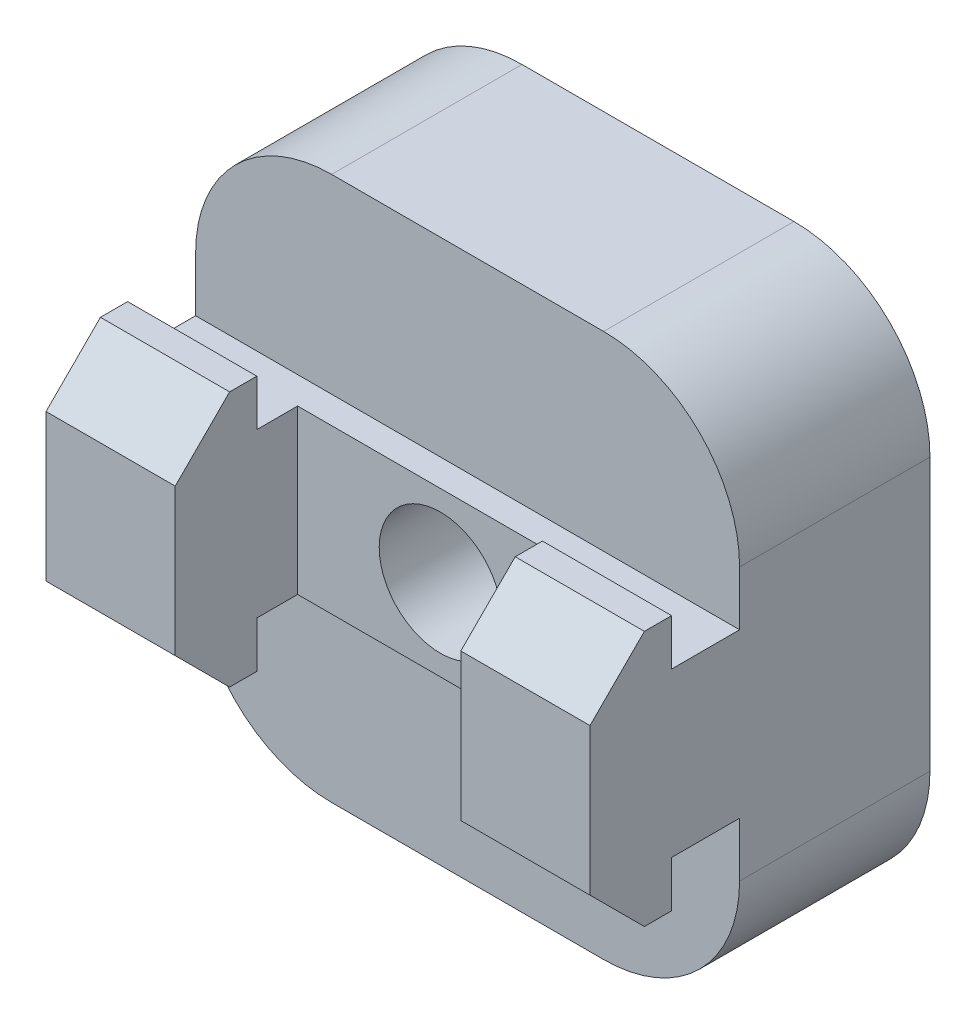
ISO-10303-21;
HEADER;
FILE_DESCRIPTION(('STEP AP214'),'2;1');
FILE_NAME('part.step','',(''),(''),'','','');
FILE_SCHEMA(('AUTOMOTIVE_DESIGN { 1 0 10303 214 1 1 1 1 }'));
ENDSEC;
DATA;
#1=APPLICATION_CONTEXT('core data for automotive mechanical design processes');
#2=APPLICATION_PROTOCOL_DEFINITION('international standard','automotive_design',2000,#1);
#3=PRODUCT_CONTEXT('',#1,'mechanical');
#4=PRODUCT('Part','Part','',(#3));
#5=PRODUCT_RELATED_PRODUCT_CATEGORY('part','',(#4));
#6=PRODUCT_DEFINITION_FORMATION('','',#4);
#7=PRODUCT_DEFINITION_CONTEXT('part definition',#1,'design');
#8=PRODUCT_DEFINITION('design','',#6,#7);
#9=PRODUCT_DEFINITION_SHAPE('','',#8);
#10=(LENGTH_UNIT() NAMED_UNIT(*) SI_UNIT(.MILLI.,.METRE.));
#11=(NAMED_UNIT(*) PLANE_ANGLE_UNIT() SI_UNIT($,.RADIAN.));
#12=(NAMED_UNIT(*) SI_UNIT($,.STERADIAN.) SOLID_ANGLE_UNIT());
#13=UNCERTAINTY_MEASURE_WITH_UNIT(LENGTH_MEASURE(1.E-05),#10,'distance_accuracy_value','');
#14=(GEOMETRIC_REPRESENTATION_CONTEXT(3) GLOBAL_UNCERTAINTY_ASSIGNED_CONTEXT((#13)) GLOBAL_UNIT_ASSIGNED_CONTEXT((#10,
#11,#12)) REPRESENTATION_CONTEXT('',''));
#15=CARTESIAN_POINT('',(0.,0.,0.));
#16=DIRECTION('',(0.,0.,1.));
#17=DIRECTION('',(1.,0.,0.));
#18=AXIS2_PLACEMENT_3D('',#15,#16,#17);
#19=CARTESIAN_POINT('',(10.,3.,9.5));
#20=DIRECTION('',(0.,0.,1.));
#21=DIRECTION('',(0.,-1.,0.));
#22=AXIS2_PLACEMENT_3D('',#19,#20,#21);
#23=PLANE('',#22);
#24=DIRECTION('',(0.,-1.,0.));
#25=VECTOR('',#24,1.);
#26=CARTESIAN_POINT('',(5.25,3.,9.5));
#27=LINE('',#26,#25);
#28=CARTESIAN_POINT('',(5.25,4.7,9.5));
#29=VERTEX_POINT('',#28);
#30=CARTESIAN_POINT('',(5.25,3.,9.5));
#31=VERTEX_POINT('',#30);
#32=EDGE_CURVE('E268',#29,#31,#27,.T.);
#33=ORIENTED_EDGE('',*,*,#32,.F.);
#34=DIRECTION('',(-1.,0.,0.));
#35=VECTOR('',#34,1.);
#36=CARTESIAN_POINT('',(10.,4.7,9.5));
#37=LINE('',#36,#35);
#38=CARTESIAN_POINT('',(10.,4.7,9.5));
#39=VERTEX_POINT('',#38);
#40=EDGE_CURVE('E415',#39,#29,#37,.T.);
#41=ORIENTED_EDGE('',*,*,#40,.F.);
#42=DIRECTION('',(0.,1.,0.));
#43=VECTOR('',#42,1.);
#44=CARTESIAN_POINT('',(10.,3.,9.5));
#45=LINE('',#44,#43);
#46=CARTESIAN_POINT('',(10.,3.,9.5));
#47=VERTEX_POINT('',#46);
#48=EDGE_CURVE('E321',#47,#39,#45,.T.);
#49=ORIENTED_EDGE('',*,*,#48,.F.);
#50=DIRECTION('',(-1.,0.,0.));
#51=VECTOR('',#50,1.);
#52=CARTESIAN_POINT('',(10.,3.,9.5));
#53=LINE('',#52,#51);
#54=EDGE_CURVE('E420',#47,#31,#53,.T.);
#55=ORIENTED_EDGE('',*,*,#54,.T.);
#56=EDGE_LOOP('',(#33,#41,#49,#55));
#57=FACE_BOUND('',#56,.T.);
#58=ADVANCED_FACE('F45',(#57),#23,.F.);
#59=CARTESIAN_POINT('',(10.,4.7,9.5));
#60=DIRECTION('',(0.,-1.,0.));
#61=DIRECTION('',(0.,0.,-1.));
#62=AXIS2_PLACEMENT_3D('',#59,#60,#61);
#63=PLANE('',#62);
#64=DIRECTION('',(0.,0.,-1.));
#65=VECTOR('',#64,1.);
#66=CARTESIAN_POINT('',(5.25,4.7,9.5));
#67=LINE('',#66,#65);
#68=CARTESIAN_POINT('',(5.25,4.7,10.5));
#69=VERTEX_POINT('',#68);
#70=EDGE_CURVE('E529',#69,#29,#67,.T.);
#71=ORIENTED_EDGE('',*,*,#70,.F.);
#72=DIRECTION('',(-1.,0.,0.));
#73=VECTOR('',#72,1.);
#74=CARTESIAN_POINT('',(10.,4.7,10.5));
#75=LINE('',#74,#73);
#76=CARTESIAN_POINT('',(10.,4.7,10.5));
#77=VERTEX_POINT('',#76);
#78=EDGE_CURVE('E410',#77,#69,#75,.T.);
#79=ORIENTED_EDGE('',*,*,#78,.F.);
#80=DIRECTION('',(0.,0.,1.));
#81=VECTOR('',#80,1.);
#82=CARTESIAN_POINT('',(10.,4.7,9.5));
#83=LINE('',#82,#81);
#84=EDGE_CURVE('E324',#39,#77,#83,.T.);
#85=ORIENTED_EDGE('',*,*,#84,.F.);
#86=ORIENTED_EDGE('',*,*,#40,.T.);
#87=EDGE_LOOP('',(#71,#79,#85,#86));
#88=FACE_BOUND('',#87,.T.);
#89=ADVANCED_FACE('F527',(#88),#63,.F.);
#90=CARTESIAN_POINT('',(10.,4.7,10.5));
#91=DIRECTION('',(0.,-0.707106781186547,-0.707106781186548));
#92=DIRECTION('',(0.,0.707106781186548,-0.707106781186547));
#93=AXIS2_PLACEMENT_3D('',#90,#91,#92);
#94=PLANE('',#93);
#95=DIRECTION('',(0.,0.707106781186548,-0.707106781186547));
#96=VECTOR('',#95,1.);
#97=CARTESIAN_POINT('',(5.25,4.7,10.5));
#98=LINE('',#97,#96);
#99=CARTESIAN_POINT('',(5.25,2.7,12.5));
#100=VERTEX_POINT('',#99);
#101=EDGE_CURVE('E646',#100,#69,#98,.T.);
#102=ORIENTED_EDGE('',*,*,#101,.F.);
#103=DIRECTION('',(-1.,0.,0.));
#104=VECTOR('',#103,1.);
#105=CARTESIAN_POINT('',(10.,2.7,12.5));
#106=LINE('',#105,#104);
#107=CARTESIAN_POINT('',(10.,2.7,12.5));
#108=VERTEX_POINT('',#107);
#109=EDGE_CURVE('E405',#108,#100,#106,.T.);
#110=ORIENTED_EDGE('',*,*,#109,.F.);
#111=DIRECTION('',(0.,-0.707106781186548,0.707106781186547));
#112=VECTOR('',#111,1.);
#113=CARTESIAN_POINT('',(10.,4.7,10.5));
#114=LINE('',#113,#112);
#115=EDGE_CURVE('E327',#77,#108,#114,.T.);
#116=ORIENTED_EDGE('',*,*,#115,.F.);
#117=ORIENTED_EDGE('',*,*,#78,.T.);
#118=EDGE_LOOP('',(#102,#110,#116,#117));
#119=FACE_BOUND('',#118,.T.);
#120=ADVANCED_FACE('F533',(#119),#94,.F.);
#121=CARTESIAN_POINT('',(10.,2.7,12.5));
#122=DIRECTION('',(0.,0.,-1.));
#123=DIRECTION('',(-1.,0.,0.));
#124=AXIS2_PLACEMENT_3D('',#121,#122,#123);
#125=PLANE('',#124);
#126=DIRECTION('',(0.,1.,0.));
#127=VECTOR('',#126,1.);
#128=CARTESIAN_POINT('',(5.25,2.7,12.5));
#129=LINE('',#128,#127);
#130=CARTESIAN_POINT('',(5.25,-2.7,12.5));
#131=VERTEX_POINT('',#130);
#132=EDGE_CURVE('E541',#131,#100,#129,.T.);
#133=ORIENTED_EDGE('',*,*,#132,.F.);
#134=DIRECTION('',(-1.,0.,0.));
#135=VECTOR('',#134,1.);
#136=CARTESIAN_POINT('',(10.,-2.7,12.5));
#137=LINE('',#136,#135);
#138=CARTESIAN_POINT('',(10.,-2.7,12.5));
#139=VERTEX_POINT('',#138);
#140=EDGE_CURVE('E400',#139,#131,#137,.T.);
#141=ORIENTED_EDGE('',*,*,#140,.F.);
#142=DIRECTION('',(0.,-1.,0.));
#143=VECTOR('',#142,1.);
#144=CARTESIAN_POINT('',(10.,2.7,12.5));
#145=LINE('',#144,#143);
#146=EDGE_CURVE('E330',#108,#139,#145,.T.);
#147=ORIENTED_EDGE('',*,*,#146,.F.);
#148=ORIENTED_EDGE('',*,*,#109,.T.);
#149=EDGE_LOOP('',(#133,#141,#147,#148));
#150=FACE_BOUND('',#149,.T.);
#151=ADVANCED_FACE('F540',(#150),#125,.F.);
#152=CARTESIAN_POINT('',(10.,-4.7,10.5));
#153=DIRECTION('',(0.,0.707106781186547,-0.707106781186548));
#154=DIRECTION('',(0.,0.707106781186548,0.707106781186547));
#155=AXIS2_PLACEMENT_3D('',#152,#153,#154);
#156=PLANE('',#155);
#157=DIRECTION('',(0.,0.707106781186548,0.707106781186547));
#158=VECTOR('',#157,1.);
#159=CARTESIAN_POINT('',(5.25,-4.7,10.5));
#160=LINE('',#159,#158);
#161=CARTESIAN_POINT('',(5.25,-4.7,10.5));
#162=VERTEX_POINT('',#161);
#163=EDGE_CURVE('E546',#162,#131,#160,.T.);
#164=ORIENTED_EDGE('',*,*,#163,.F.);
#165=DIRECTION('',(-1.,0.,0.));
#166=VECTOR('',#165,1.);
#167=CARTESIAN_POINT('',(10.,-4.7,10.5));
#168=LINE('',#167,#166);
#169=CARTESIAN_POINT('',(10.,-4.7,10.5));
#170=VERTEX_POINT('',#169);
#171=EDGE_CURVE('E395',#170,#162,#168,.T.);
#172=ORIENTED_EDGE('',*,*,#171,.F.);
#173=DIRECTION('',(0.,-0.707106781186548,-0.707106781186547));
#174=VECTOR('',#173,1.);
#175=CARTESIAN_POINT('',(10.,-4.7,10.5));
#176=LINE('',#175,#174);
#177=EDGE_CURVE('E333',#139,#170,#176,.T.);
#178=ORIENTED_EDGE('',*,*,#177,.F.);
#179=ORIENTED_EDGE('',*,*,#140,.T.);
#180=EDGE_LOOP('',(#164,#172,#178,#179));
#181=FACE_BOUND('',#180,.T.);
#182=ADVANCED_FACE('F544',(#181),#156,.F.);
#183=CARTESIAN_POINT('',(10.,-4.7,9.5));
#184=DIRECTION('',(0.,1.,0.));
#185=DIRECTION('',(0.,0.,1.));
#186=AXIS2_PLACEMENT_3D('',#183,#184,#185);
#187=PLANE('',#186);
#188=DIRECTION('',(0.,0.,1.));
#189=VECTOR('',#188,1.);
#190=CARTESIAN_POINT('',(5.25,-4.7,9.5));
#191=LINE('',#190,#189);
#192=CARTESIAN_POINT('',(5.25,-4.7,9.5));
#193=VERTEX_POINT('',#192);
#194=EDGE_CURVE('E244',#193,#162,#191,.T.);
#195=ORIENTED_EDGE('',*,*,#194,.F.);
#196=DIRECTION('',(-1.,0.,0.));
#197=VECTOR('',#196,1.);
#198=CARTESIAN_POINT('',(10.,-4.7,9.5));
#199=LINE('',#198,#197);
#200=CARTESIAN_POINT('',(10.,-4.7,9.5));
#201=VERTEX_POINT('',#200);
#202=EDGE_CURVE('E390',#201,#193,#199,.T.);
#203=ORIENTED_EDGE('',*,*,#202,.F.);
#204=DIRECTION('',(0.,0.,-1.));
#205=VECTOR('',#204,1.);
#206=CARTESIAN_POINT('',(10.,-4.7,9.5));
#207=LINE('',#206,#205);
#208=EDGE_CURVE('E336',#170,#201,#207,.T.);
#209=ORIENTED_EDGE('',*,*,#208,.F.);
#210=ORIENTED_EDGE('',*,*,#171,.T.);
#211=EDGE_LOOP('',(#195,#203,#209,#210));
#212=FACE_BOUND('',#211,.T.);
#213=ADVANCED_FACE('F550',(#212),#187,.F.);
#214=CARTESIAN_POINT('',(10.,-3.,9.5));
#215=DIRECTION('',(0.,0.,1.));
#216=DIRECTION('',(0.,-1.,0.));
#217=AXIS2_PLACEMENT_3D('',#214,#215,#216);
#218=PLANE('',#217);
#219=DIRECTION('',(0.,-1.,0.));
#220=VECTOR('',#219,1.);
#221=CARTESIAN_POINT('',(5.25,-3.,9.5));
#222=LINE('',#221,#220);
#223=CARTESIAN_POINT('',(5.25,-3.,9.5));
#224=VERTEX_POINT('',#223);
#225=EDGE_CURVE('E447',#224,#193,#222,.T.);
#226=ORIENTED_EDGE('',*,*,#225,.F.);
#227=DIRECTION('',(-1.,0.,0.));
#228=VECTOR('',#227,1.);
#229=CARTESIAN_POINT('',(10.,-3.,9.5));
#230=LINE('',#229,#228);
#231=CARTESIAN_POINT('',(10.,-3.,9.5));
#232=VERTEX_POINT('',#231);
#233=EDGE_CURVE('E259',#232,#224,#230,.T.);
#234=ORIENTED_EDGE('',*,*,#233,.F.);
#235=DIRECTION('',(0.,1.,0.));
#236=VECTOR('',#235,1.);
#237=CARTESIAN_POINT('',(10.,-3.,9.5));
#238=LINE('',#237,#236);
#239=EDGE_CURVE('E339',#201,#232,#238,.T.);
#240=ORIENTED_EDGE('',*,*,#239,.F.);
#241=ORIENTED_EDGE('',*,*,#202,.T.);
#242=EDGE_LOOP('',(#226,#234,#240,#241));
#243=FACE_BOUND('',#242,.T.);
#244=ADVANCED_FACE('F554',(#243),#218,.F.);
#245=CARTESIAN_POINT('',(10.,-3.,9.5));
#246=DIRECTION('',(0.,1.,0.));
#247=DIRECTION('',(0.,0.,1.));
#248=AXIS2_PLACEMENT_3D('',#245,#246,#247);
#249=PLANE('',#248);
#250=DIRECTION('',(-1.,0.,0.));
#251=VECTOR('',#250,1.);
#252=CARTESIAN_POINT('',(10.,-3.,8.));
#253=LINE('',#252,#251);
#254=CARTESIAN_POINT('',(5.25,-3.,8.));
#255=VERTEX_POINT('',#254);
#256=CARTESIAN_POINT('',(-5.25,-3.,8.));
#257=VERTEX_POINT('',#256);
#258=EDGE_CURVE('E233',#255,#257,#253,.T.);
#259=ORIENTED_EDGE('',*,*,#258,.T.);
#260=DIRECTION('',(0.,0.,1.));
#261=VECTOR('',#260,1.);
#262=CARTESIAN_POINT('',(-5.25,-3.,9.5));
#263=LINE('',#262,#261);
#264=CARTESIAN_POINT('',(-5.25,-3.,9.5));
#265=VERTEX_POINT('',#264);
#266=EDGE_CURVE('E295',#257,#265,#263,.T.);
#267=ORIENTED_EDGE('',*,*,#266,.T.);
#268=CARTESIAN_POINT('',(-10.,-3.,9.5));
#269=VERTEX_POINT('',#268);
#270=EDGE_CURVE('E342',#265,#269,#230,.T.);
#271=ORIENTED_EDGE('',*,*,#270,.T.);
#272=DIRECTION('',(0.,0.,-1.));
#273=VECTOR('',#272,1.);
#274=CARTESIAN_POINT('',(-10.,-3.,9.5));
#275=LINE('',#274,#273);
#276=CARTESIAN_POINT('',(-10.,-3.,7.));
#277=VERTEX_POINT('',#276);
#278=EDGE_CURVE('E302',#269,#277,#275,.T.);
#279=ORIENTED_EDGE('',*,*,#278,.T.);
#280=DIRECTION('',(-1.,0.,0.));
#281=VECTOR('',#280,1.);
#282=CARTESIAN_POINT('',(10.,-3.,7.));
#283=LINE('',#282,#281);
#284=CARTESIAN_POINT('',(10.,-3.,7.));
#285=VERTEX_POINT('',#284);
#286=EDGE_CURVE('E443',#285,#277,#283,.T.);
#287=ORIENTED_EDGE('',*,*,#286,.F.);
#288=DIRECTION('',(0.,0.,-1.));
#289=VECTOR('',#288,1.);
#290=CARTESIAN_POINT('',(10.,-3.,9.5));
#291=LINE('',#290,#289);
#292=EDGE_CURVE('E303',#232,#285,#291,.T.);
#293=ORIENTED_EDGE('',*,*,#292,.F.);
#294=ORIENTED_EDGE('',*,*,#233,.T.);
#295=DIRECTION('',(0.,0.,1.));
#296=VECTOR('',#295,1.);
#297=CARTESIAN_POINT('',(5.25,-3.,9.5));
#298=LINE('',#297,#296);
#299=EDGE_CURVE('E249',#255,#224,#298,.T.);
#300=ORIENTED_EDGE('',*,*,#299,.F.);
#301=EDGE_LOOP('',(#259,#267,#271,#279,#287,#293,#294,#300));
#302=FACE_BOUND('',#301,.T.);
#303=ADVANCED_FACE('F256',(#302),#249,.F.);
#304=CARTESIAN_POINT('',(10.,-10.,7.));
#305=DIRECTION('',(0.,0.,-1.));
#306=DIRECTION('',(0.,1.,0.));
#307=AXIS2_PLACEMENT_3D('',#304,#305,#306);
#308=PLANE('',#307);
#309=DIRECTION('',(0.,-1.,0.));
#310=VECTOR('',#309,1.);
#311=CARTESIAN_POINT('',(-10.,-10.,7.));
#312=LINE('',#311,#310);
#313=CARTESIAN_POINT('',(-10.,-5.,7.));
#314=VERTEX_POINT('',#313);
#315=EDGE_CURVE('E346',#277,#314,#312,.T.);
#316=ORIENTED_EDGE('',*,*,#315,.T.);
#317=CARTESIAN_POINT('',(-5.,-5.,7.));
#318=DIRECTION('',(0.,0.,-1.));
#319=DIRECTION('',(0.,1.,0.));
#320=AXIS2_PLACEMENT_3D('',#317,#318,#319);
#321=CIRCLE('',#320,5.);
#322=CARTESIAN_POINT('',(-5.,-10.,7.));
#323=VERTEX_POINT('',#322);
#324=EDGE_CURVE('E67',#314,#323,#321,.F.);
#325=ORIENTED_EDGE('',*,*,#324,.T.);
#326=DIRECTION('',(-1.,0.,0.));
#327=VECTOR('',#326,1.);
#328=CARTESIAN_POINT('',(10.,-10.,7.));
#329=LINE('',#328,#327);
#330=CARTESIAN_POINT('',(5.,-10.,7.));
#331=VERTEX_POINT('',#330);
#332=EDGE_CURVE('E440',#331,#323,#329,.T.);
#333=ORIENTED_EDGE('',*,*,#332,.F.);
#334=CARTESIAN_POINT('',(5.,-5.,7.));
#335=DIRECTION('',(0.,0.,-1.));
#336=DIRECTION('',(0.,1.,0.));
#337=AXIS2_PLACEMENT_3D('',#334,#335,#336);
#338=CIRCLE('',#337,5.);
#339=CARTESIAN_POINT('',(10.,-5.,7.));
#340=VERTEX_POINT('',#339);
#341=EDGE_CURVE('E61',#331,#340,#338,.F.);
#342=ORIENTED_EDGE('',*,*,#341,.T.);
#343=DIRECTION('',(0.,-1.,0.));
#344=VECTOR('',#343,1.);
#345=CARTESIAN_POINT('',(10.,-10.,7.));
#346=LINE('',#345,#344);
#347=EDGE_CURVE('E307',#285,#340,#346,.T.);
#348=ORIENTED_EDGE('',*,*,#347,.F.);
#349=ORIENTED_EDGE('',*,*,#286,.T.);
#350=EDGE_LOOP('',(#316,#325,#333,#342,#348,#349));
#351=FACE_BOUND('',#350,.T.);
#352=ADVANCED_FACE('F556',(#351),#308,.F.);
#353=CARTESIAN_POINT('',(10.,-10.,0.));
#354=DIRECTION('',(0.,1.,0.));
#355=DIRECTION('',(0.,0.,1.));
#356=AXIS2_PLACEMENT_3D('',#353,#354,#355);
#357=PLANE('',#356);
#358=ORIENTED_EDGE('',*,*,#332,.T.);
#359=DIRECTION('',(0.,0.,-1.));
#360=VECTOR('',#359,1.);
#361=CARTESIAN_POINT('',(-5.,-10.,0.));
#362=LINE('',#361,#360);
#363=CARTESIAN_POINT('',(-5.,-10.,0.));
#364=VERTEX_POINT('',#363);
#365=EDGE_CURVE('E492',#323,#364,#362,.T.);
#366=ORIENTED_EDGE('',*,*,#365,.T.);
#367=DIRECTION('',(-1.,0.,0.));
#368=VECTOR('',#367,1.);
#369=CARTESIAN_POINT('',(10.,-10.,0.));
#370=LINE('',#369,#368);
#371=CARTESIAN_POINT('',(5.,-10.,0.));
#372=VERTEX_POINT('',#371);
#373=EDGE_CURVE('E436',#372,#364,#370,.T.);
#374=ORIENTED_EDGE('',*,*,#373,.F.);
#375=DIRECTION('',(0.,0.,-1.));
#376=VECTOR('',#375,1.);
#377=CARTESIAN_POINT('',(5.,-10.,7.));
#378=LINE('',#377,#376);
#379=EDGE_CURVE('E489',#372,#331,#378,.F.);
#380=ORIENTED_EDGE('',*,*,#379,.T.);
#381=EDGE_LOOP('',(#358,#366,#374,#380));
#382=FACE_BOUND('',#381,.T.);
#383=ADVANCED_FACE('F565',(#382),#357,.F.);
#384=CARTESIAN_POINT('',(10.,-10.,0.));
#385=DIRECTION('',(0.,0.,1.));
#386=DIRECTION('',(1.,0.,0.));
#387=AXIS2_PLACEMENT_3D('',#384,#385,#386);
#388=PLANE('',#387);
#389=CARTESIAN_POINT('',(0.,0.,0.));
#390=DIRECTION('',(0.,0.,-1.));
#391=DIRECTION('',(-1.,0.,0.));
#392=AXIS2_PLACEMENT_3D('',#389,#390,#391);
#393=CIRCLE('',#392,2.25);
#394=CARTESIAN_POINT('',(-2.25,0.,0.));
#395=VERTEX_POINT('',#394);
#396=EDGE_CURVE('E298',#395,#395,#393,.T.);
#397=ORIENTED_EDGE('',*,*,#396,.F.);
#398=EDGE_LOOP('',(#397));
#399=FACE_BOUND('',#398,.T.);
#400=DIRECTION('',(0.,1.,0.));
#401=VECTOR('',#400,1.);
#402=CARTESIAN_POINT('',(-10.,-10.,0.));
#403=LINE('',#402,#401);
#404=CARTESIAN_POINT('',(-10.,-5.,0.));
#405=VERTEX_POINT('',#404);
#406=CARTESIAN_POINT('',(-10.,5.,0.));
#407=VERTEX_POINT('',#406);
#408=EDGE_CURVE('E349',#405,#407,#403,.T.);
#409=ORIENTED_EDGE('',*,*,#408,.T.);
#410=CARTESIAN_POINT('',(-5.,5.,0.));
#411=DIRECTION('',(0.,0.,1.));
#412=DIRECTION('',(1.,0.,0.));
#413=AXIS2_PLACEMENT_3D('',#410,#411,#412);
#414=CIRCLE('',#413,5.);
#415=CARTESIAN_POINT('',(-5.,10.,0.));
#416=VERTEX_POINT('',#415);
#417=EDGE_CURVE('E486',#407,#416,#414,.F.);
#418=ORIENTED_EDGE('',*,*,#417,.T.);
#419=DIRECTION('',(-1.,0.,0.));
#420=VECTOR('',#419,1.);
#421=CARTESIAN_POINT('',(10.,10.,0.));
#422=LINE('',#421,#420);
#423=CARTESIAN_POINT('',(5.,10.,0.));
#424=VERTEX_POINT('',#423);
#425=EDGE_CURVE('E432',#424,#416,#422,.T.);
#426=ORIENTED_EDGE('',*,*,#425,.F.);
#427=CARTESIAN_POINT('',(5.,5.,0.));
#428=DIRECTION('',(0.,0.,1.));
#429=DIRECTION('',(1.,0.,0.));
#430=AXIS2_PLACEMENT_3D('',#427,#428,#429);
#431=CIRCLE('',#430,5.);
#432=CARTESIAN_POINT('',(10.,5.,0.));
#433=VERTEX_POINT('',#432);
#434=EDGE_CURVE('E477',#424,#433,#431,.F.);
#435=ORIENTED_EDGE('',*,*,#434,.T.);
#436=DIRECTION('',(0.,1.,0.));
#437=VECTOR('',#436,1.);
#438=CARTESIAN_POINT('',(10.,-10.,0.));
#439=LINE('',#438,#437);
#440=CARTESIAN_POINT('',(10.,-5.,0.));
#441=VERTEX_POINT('',#440);
#442=EDGE_CURVE('E311',#441,#433,#439,.T.);
#443=ORIENTED_EDGE('',*,*,#442,.F.);
#444=CARTESIAN_POINT('',(5.,-5.,0.));
#445=DIRECTION('',(0.,0.,1.));
#446=DIRECTION('',(1.,0.,0.));
#447=AXIS2_PLACEMENT_3D('',#444,#445,#446);
#448=CIRCLE('',#447,5.);
#449=EDGE_CURVE('E480',#441,#372,#448,.F.);
#450=ORIENTED_EDGE('',*,*,#449,.T.);
#451=ORIENTED_EDGE('',*,*,#373,.T.);
#452=CARTESIAN_POINT('',(-5.,-5.,0.));
#453=DIRECTION('',(0.,0.,1.));
#454=DIRECTION('',(1.,0.,0.));
#455=AXIS2_PLACEMENT_3D('',#452,#453,#454);
#456=CIRCLE('',#455,5.);
#457=EDGE_CURVE('E483',#364,#405,#456,.F.);
#458=ORIENTED_EDGE('',*,*,#457,.T.);
#459=EDGE_LOOP('',(#409,#418,#426,#435,#443,#450,#451,#458));
#460=FACE_BOUND('',#459,.T.);
#461=ADVANCED_FACE('F563',(#399,#460),#388,.F.);
#462=CARTESIAN_POINT('',(10.,10.,0.));
#463=DIRECTION('',(0.,-1.,0.));
#464=DIRECTION('',(0.,0.,-1.));
#465=AXIS2_PLACEMENT_3D('',#462,#463,#464);
#466=PLANE('',#465);
#467=ORIENTED_EDGE('',*,*,#425,.T.);
#468=DIRECTION('',(0.,0.,1.));
#469=VECTOR('',#468,1.);
#470=CARTESIAN_POINT('',(-5.,10.,0.));
#471=LINE('',#470,#469);
#472=CARTESIAN_POINT('',(-5.,10.,7.));
#473=VERTEX_POINT('',#472);
#474=EDGE_CURVE('E461',#416,#473,#471,.T.);
#475=ORIENTED_EDGE('',*,*,#474,.T.);
#476=DIRECTION('',(-1.,0.,0.));
#477=VECTOR('',#476,1.);
#478=CARTESIAN_POINT('',(10.,10.,7.));
#479=LINE('',#478,#477);
#480=CARTESIAN_POINT('',(5.,10.,7.));
#481=VERTEX_POINT('',#480);
#482=EDGE_CURVE('E428',#481,#473,#479,.T.);
#483=ORIENTED_EDGE('',*,*,#482,.F.);
#484=DIRECTION('',(0.,0.,1.));
#485=VECTOR('',#484,1.);
#486=CARTESIAN_POINT('',(5.,10.,0.));
#487=LINE('',#486,#485);
#488=EDGE_CURVE('E458',#481,#424,#487,.F.);
#489=ORIENTED_EDGE('',*,*,#488,.T.);
#490=EDGE_LOOP('',(#467,#475,#483,#489));
#491=FACE_BOUND('',#490,.T.);
#492=ADVANCED_FACE('F580',(#491),#466,.F.);
#493=CARTESIAN_POINT('',(10.,10.,7.));
#494=DIRECTION('',(0.,0.,-1.));
#495=DIRECTION('',(0.,1.,0.));
#496=AXIS2_PLACEMENT_3D('',#493,#494,#495);
#497=PLANE('',#496);
#498=ORIENTED_EDGE('',*,*,#482,.T.);
#499=CARTESIAN_POINT('',(-5.,5.,7.));
#500=DIRECTION('',(0.,0.,-1.));
#501=DIRECTION('',(0.,1.,0.));
#502=AXIS2_PLACEMENT_3D('',#499,#500,#501);
#503=CIRCLE('',#502,5.);
#504=CARTESIAN_POINT('',(-10.,5.,7.));
#505=VERTEX_POINT('',#504);
#506=EDGE_CURVE('E468',#473,#505,#503,.F.);
#507=ORIENTED_EDGE('',*,*,#506,.T.);
#508=DIRECTION('',(0.,-1.,0.));
#509=VECTOR('',#508,1.);
#510=CARTESIAN_POINT('',(-10.,10.,7.));
#511=LINE('',#510,#509);
#512=CARTESIAN_POINT('',(-10.,3.,7.));
#513=VERTEX_POINT('',#512);
#514=EDGE_CURVE('E353',#505,#513,#511,.T.);
#515=ORIENTED_EDGE('',*,*,#514,.T.);
#516=DIRECTION('',(-1.,0.,0.));
#517=VECTOR('',#516,1.);
#518=CARTESIAN_POINT('',(10.,3.,7.));
#519=LINE('',#518,#517);
#520=CARTESIAN_POINT('',(10.,3.,7.));
#521=VERTEX_POINT('',#520);
#522=EDGE_CURVE('E424',#521,#513,#519,.T.);
#523=ORIENTED_EDGE('',*,*,#522,.F.);
#524=DIRECTION('',(0.,-1.,0.));
#525=VECTOR('',#524,1.);
#526=CARTESIAN_POINT('',(10.,10.,7.));
#527=LINE('',#526,#525);
#528=CARTESIAN_POINT('',(10.,5.,7.));
#529=VERTEX_POINT('',#528);
#530=EDGE_CURVE('E315',#529,#521,#527,.T.);
#531=ORIENTED_EDGE('',*,*,#530,.F.);
#532=CARTESIAN_POINT('',(5.,5.,7.));
#533=DIRECTION('',(0.,0.,-1.));
#534=DIRECTION('',(0.,1.,0.));
#535=AXIS2_PLACEMENT_3D('',#532,#533,#534);
#536=CIRCLE('',#535,5.);
#537=EDGE_CURVE('E465',#529,#481,#536,.F.);
#538=ORIENTED_EDGE('',*,*,#537,.T.);
#539=EDGE_LOOP('',(#498,#507,#515,#523,#531,#538));
#540=FACE_BOUND('',#539,.T.);
#541=ADVANCED_FACE('F510',(#540),#497,.F.);
#542=CARTESIAN_POINT('',(10.,3.,9.5));
#543=DIRECTION('',(0.,-1.,0.));
#544=DIRECTION('',(0.,0.,-1.));
#545=AXIS2_PLACEMENT_3D('',#542,#543,#544);
#546=PLANE('',#545);
#547=CARTESIAN_POINT('',(-5.25,3.,9.5));
#548=VERTEX_POINT('',#547);
#549=CARTESIAN_POINT('',(-10.,3.,9.5));
#550=VERTEX_POINT('',#549);
#551=EDGE_CURVE('E419',#548,#550,#53,.T.);
#552=ORIENTED_EDGE('',*,*,#551,.F.);
#553=DIRECTION('',(0.,0.,-1.));
#554=VECTOR('',#553,1.);
#555=CARTESIAN_POINT('',(-5.25,3.,9.5));
#556=LINE('',#555,#554);
#557=CARTESIAN_POINT('',(-5.25,3.,8.));
#558=VERTEX_POINT('',#557);
#559=EDGE_CURVE('E291',#548,#558,#556,.T.);
#560=ORIENTED_EDGE('',*,*,#559,.T.);
#561=DIRECTION('',(1.,0.,0.));
#562=VECTOR('',#561,1.);
#563=CARTESIAN_POINT('',(10.,3.,8.));
#564=LINE('',#563,#562);
#565=CARTESIAN_POINT('',(5.25,3.,8.));
#566=VERTEX_POINT('',#565);
#567=EDGE_CURVE('E245',#558,#566,#564,.T.);
#568=ORIENTED_EDGE('',*,*,#567,.T.);
#569=DIRECTION('',(0.,0.,-1.));
#570=VECTOR('',#569,1.);
#571=CARTESIAN_POINT('',(5.25,3.,9.5));
#572=LINE('',#571,#570);
#573=EDGE_CURVE('E252',#31,#566,#572,.T.);
#574=ORIENTED_EDGE('',*,*,#573,.F.);
#575=ORIENTED_EDGE('',*,*,#54,.F.);
#576=DIRECTION('',(0.,0.,1.));
#577=VECTOR('',#576,1.);
#578=CARTESIAN_POINT('',(10.,3.,9.5));
#579=LINE('',#578,#577);
#580=EDGE_CURVE('E318',#521,#47,#579,.T.);
#581=ORIENTED_EDGE('',*,*,#580,.F.);
#582=ORIENTED_EDGE('',*,*,#522,.T.);
#583=DIRECTION('',(0.,0.,1.));
#584=VECTOR('',#583,1.);
#585=CARTESIAN_POINT('',(-10.,3.,9.5));
#586=LINE('',#585,#584);
#587=EDGE_CURVE('E356',#513,#550,#586,.T.);
#588=ORIENTED_EDGE('',*,*,#587,.T.);
#589=EDGE_LOOP('',(#552,#560,#568,#574,#575,#581,#582,#588));
#590=FACE_BOUND('',#589,.T.);
#591=ADVANCED_FACE('F518',(#590),#546,.F.);
#592=CARTESIAN_POINT('',(-5.25,4.7,9.5));
#593=VERTEX_POINT('',#592);
#594=CARTESIAN_POINT('',(-10.,4.7,9.5));
#595=VERTEX_POINT('',#594);
#596=EDGE_CURVE('E414',#593,#595,#37,.T.);
#597=ORIENTED_EDGE('',*,*,#596,.F.);
#598=DIRECTION('',(0.,-1.,0.));
#599=VECTOR('',#598,1.);
#600=CARTESIAN_POINT('',(-5.25,3.,9.5));
#601=LINE('',#600,#599);
#602=EDGE_CURVE('E287',#593,#548,#601,.T.);
#603=ORIENTED_EDGE('',*,*,#602,.T.);
#604=ORIENTED_EDGE('',*,*,#551,.T.);
#605=DIRECTION('',(0.,1.,0.));
#606=VECTOR('',#605,1.);
#607=CARTESIAN_POINT('',(-10.,3.,9.5));
#608=LINE('',#607,#606);
#609=EDGE_CURVE('E360',#550,#595,#608,.T.);
#610=ORIENTED_EDGE('',*,*,#609,.T.);
#611=EDGE_LOOP('',(#597,#603,#604,#610));
#612=FACE_BOUND('',#611,.T.);
#613=ADVANCED_FACE('F588',(#612),#23,.F.);
#614=CARTESIAN_POINT('',(-5.25,4.7,10.5));
#615=VERTEX_POINT('',#614);
#616=CARTESIAN_POINT('',(-10.,4.7,10.5));
#617=VERTEX_POINT('',#616);
#618=EDGE_CURVE('E409',#615,#617,#75,.T.);
#619=ORIENTED_EDGE('',*,*,#618,.F.);
#620=DIRECTION('',(0.,0.,-1.));
#621=VECTOR('',#620,1.);
#622=CARTESIAN_POINT('',(-5.25,4.7,9.5));
#623=LINE('',#622,#621);
#624=EDGE_CURVE('E283',#615,#593,#623,.T.);
#625=ORIENTED_EDGE('',*,*,#624,.T.);
#626=ORIENTED_EDGE('',*,*,#596,.T.);
#627=DIRECTION('',(0.,0.,1.));
#628=VECTOR('',#627,1.);
#629=CARTESIAN_POINT('',(-10.,4.7,9.5));
#630=LINE('',#629,#628);
#631=EDGE_CURVE('E364',#595,#617,#630,.T.);
#632=ORIENTED_EDGE('',*,*,#631,.T.);
#633=EDGE_LOOP('',(#619,#625,#626,#632));
#634=FACE_BOUND('',#633,.T.);
#635=ADVANCED_FACE('F593',(#634),#63,.F.);
#636=CARTESIAN_POINT('',(-5.25,2.7,12.5));
#637=VERTEX_POINT('',#636);
#638=CARTESIAN_POINT('',(-10.,2.7,12.5));
#639=VERTEX_POINT('',#638);
#640=EDGE_CURVE('E404',#637,#639,#106,.T.);
#641=ORIENTED_EDGE('',*,*,#640,.F.);
#642=DIRECTION('',(0.,0.707106781186548,-0.707106781186547));
#643=VECTOR('',#642,1.);
#644=CARTESIAN_POINT('',(-5.25,4.7,10.5));
#645=LINE('',#644,#643);
#646=EDGE_CURVE('E279',#637,#615,#645,.T.);
#647=ORIENTED_EDGE('',*,*,#646,.T.);
#648=ORIENTED_EDGE('',*,*,#618,.T.);
#649=DIRECTION('',(0.,-0.707106781186548,0.707106781186547));
#650=VECTOR('',#649,1.);
#651=CARTESIAN_POINT('',(-10.,4.7,10.5));
#652=LINE('',#651,#650);
#653=EDGE_CURVE('E368',#617,#639,#652,.T.);
#654=ORIENTED_EDGE('',*,*,#653,.T.);
#655=EDGE_LOOP('',(#641,#647,#648,#654));
#656=FACE_BOUND('',#655,.T.);
#657=ADVANCED_FACE('F601',(#656),#94,.F.);
#658=CARTESIAN_POINT('',(-5.25,-2.7,12.5));
#659=VERTEX_POINT('',#658);
#660=CARTESIAN_POINT('',(-10.,-2.7,12.5));
#661=VERTEX_POINT('',#660);
#662=EDGE_CURVE('E399',#659,#661,#137,.T.);
#663=ORIENTED_EDGE('',*,*,#662,.F.);
#664=DIRECTION('',(0.,1.,0.));
#665=VECTOR('',#664,1.);
#666=CARTESIAN_POINT('',(-5.25,2.7,12.5));
#667=LINE('',#666,#665);
#668=EDGE_CURVE('E275',#659,#637,#667,.T.);
#669=ORIENTED_EDGE('',*,*,#668,.T.);
#670=ORIENTED_EDGE('',*,*,#640,.T.);
#671=DIRECTION('',(0.,-1.,0.));
#672=VECTOR('',#671,1.);
#673=CARTESIAN_POINT('',(-10.,2.7,12.5));
#674=LINE('',#673,#672);
#675=EDGE_CURVE('E372',#639,#661,#674,.T.);
#676=ORIENTED_EDGE('',*,*,#675,.T.);
#677=EDGE_LOOP('',(#663,#669,#670,#676));
#678=FACE_BOUND('',#677,.T.);
#679=ADVANCED_FACE('F629',(#678),#125,.F.);
#680=CARTESIAN_POINT('',(-5.25,-4.7,10.5));
#681=VERTEX_POINT('',#680);
#682=CARTESIAN_POINT('',(-10.,-4.7,10.5));
#683=VERTEX_POINT('',#682);
#684=EDGE_CURVE('E394',#681,#683,#168,.T.);
#685=ORIENTED_EDGE('',*,*,#684,.F.);
#686=DIRECTION('',(0.,0.707106781186548,0.707106781186547));
#687=VECTOR('',#686,1.);
#688=CARTESIAN_POINT('',(-5.25,-4.7,10.5));
#689=LINE('',#688,#687);
#690=EDGE_CURVE('E266',#681,#659,#689,.T.);
#691=ORIENTED_EDGE('',*,*,#690,.T.);
#692=ORIENTED_EDGE('',*,*,#662,.T.);
#693=DIRECTION('',(0.,-0.707106781186548,-0.707106781186547));
#694=VECTOR('',#693,1.);
#695=CARTESIAN_POINT('',(-10.,-4.7,10.5));
#696=LINE('',#695,#694);
#697=EDGE_CURVE('E376',#661,#683,#696,.T.);
#698=ORIENTED_EDGE('',*,*,#697,.T.);
#699=EDGE_LOOP('',(#685,#691,#692,#698));
#700=FACE_BOUND('',#699,.T.);
#701=ADVANCED_FACE('F626',(#700),#156,.F.);
#702=CARTESIAN_POINT('',(-5.25,-4.7,9.5));
#703=VERTEX_POINT('',#702);
#704=CARTESIAN_POINT('',(-10.,-4.7,9.5));
#705=VERTEX_POINT('',#704);
#706=EDGE_CURVE('E389',#703,#705,#199,.T.);
#707=ORIENTED_EDGE('',*,*,#706,.F.);
#708=DIRECTION('',(0.,0.,1.));
#709=VECTOR('',#708,1.);
#710=CARTESIAN_POINT('',(-5.25,-4.7,9.5));
#711=LINE('',#710,#709);
#712=EDGE_CURVE('E261',#703,#681,#711,.T.);
#713=ORIENTED_EDGE('',*,*,#712,.T.);
#714=ORIENTED_EDGE('',*,*,#684,.T.);
#715=DIRECTION('',(0.,0.,-1.));
#716=VECTOR('',#715,1.);
#717=CARTESIAN_POINT('',(-10.,-4.7,9.5));
#718=LINE('',#717,#716);
#719=EDGE_CURVE('E380',#683,#705,#718,.T.);
#720=ORIENTED_EDGE('',*,*,#719,.T.);
#721=EDGE_LOOP('',(#707,#713,#714,#720));
#722=FACE_BOUND('',#721,.T.);
#723=ADVANCED_FACE('F623',(#722),#187,.F.);
#724=ORIENTED_EDGE('',*,*,#270,.F.);
#725=DIRECTION('',(0.,-1.,0.));
#726=VECTOR('',#725,1.);
#727=CARTESIAN_POINT('',(-5.25,-3.,9.5));
#728=LINE('',#727,#726);
#729=EDGE_CURVE('E454',#265,#703,#728,.T.);
#730=ORIENTED_EDGE('',*,*,#729,.T.);
#731=ORIENTED_EDGE('',*,*,#706,.T.);
#732=DIRECTION('',(0.,1.,0.));
#733=VECTOR('',#732,1.);
#734=CARTESIAN_POINT('',(-10.,-3.,9.5));
#735=LINE('',#734,#733);
#736=EDGE_CURVE('E308',#705,#269,#735,.T.);
#737=ORIENTED_EDGE('',*,*,#736,.T.);
#738=EDGE_LOOP('',(#724,#730,#731,#737));
#739=FACE_BOUND('',#738,.T.);
#740=ADVANCED_FACE('F617',(#739),#218,.F.);
#741=CARTESIAN_POINT('',(10.,0.,0.));
#742=DIRECTION('',(1.,0.,0.));
#743=DIRECTION('',(0.,0.,-1.));
#744=AXIS2_PLACEMENT_3D('',#741,#742,#743);
#745=PLANE('',#744);
#746=ORIENTED_EDGE('',*,*,#347,.T.);
#747=DIRECTION('',(0.,0.,-1.));
#748=VECTOR('',#747,1.);
#749=CARTESIAN_POINT('',(10.,-5.,0.));
#750=LINE('',#749,#748);
#751=EDGE_CURVE('E11',#340,#441,#750,.T.);
#752=ORIENTED_EDGE('',*,*,#751,.T.);
#753=ORIENTED_EDGE('',*,*,#442,.T.);
#754=DIRECTION('',(0.,0.,1.));
#755=VECTOR('',#754,1.);
#756=CARTESIAN_POINT('',(10.,5.,7.));
#757=LINE('',#756,#755);
#758=EDGE_CURVE('E54',#433,#529,#757,.T.);
#759=ORIENTED_EDGE('',*,*,#758,.T.);
#760=ORIENTED_EDGE('',*,*,#530,.T.);
#761=ORIENTED_EDGE('',*,*,#580,.T.);
#762=ORIENTED_EDGE('',*,*,#48,.T.);
#763=ORIENTED_EDGE('',*,*,#84,.T.);
#764=ORIENTED_EDGE('',*,*,#115,.T.);
#765=ORIENTED_EDGE('',*,*,#146,.T.);
#766=ORIENTED_EDGE('',*,*,#177,.T.);
#767=ORIENTED_EDGE('',*,*,#208,.T.);
#768=ORIENTED_EDGE('',*,*,#239,.T.);
#769=ORIENTED_EDGE('',*,*,#292,.T.);
#770=EDGE_LOOP('',(#746,#752,#753,#759,#760,#761,#762,#763,#764,#765,#766,#767,#768,#769));
#771=FACE_BOUND('',#770,.T.);
#772=ADVANCED_FACE('F504',(#771),#745,.T.);
#773=CARTESIAN_POINT('',(-10.,0.,0.));
#774=DIRECTION('',(1.,0.,0.));
#775=DIRECTION('',(0.,0.,-1.));
#776=AXIS2_PLACEMENT_3D('',#773,#774,#775);
#777=PLANE('',#776);
#778=ORIENTED_EDGE('',*,*,#514,.F.);
#779=DIRECTION('',(0.,0.,1.));
#780=VECTOR('',#779,1.);
#781=CARTESIAN_POINT('',(-10.,5.,0.));
#782=LINE('',#781,#780);
#783=EDGE_CURVE('E474',#505,#407,#782,.F.);
#784=ORIENTED_EDGE('',*,*,#783,.T.);
#785=ORIENTED_EDGE('',*,*,#408,.F.);
#786=DIRECTION('',(0.,0.,-1.));
#787=VECTOR('',#786,1.);
#788=CARTESIAN_POINT('',(-10.,-5.,0.));
#789=LINE('',#788,#787);
#790=EDGE_CURVE('E471',#405,#314,#789,.F.);
#791=ORIENTED_EDGE('',*,*,#790,.T.);
#792=ORIENTED_EDGE('',*,*,#315,.F.);
#793=ORIENTED_EDGE('',*,*,#278,.F.);
#794=ORIENTED_EDGE('',*,*,#736,.F.);
#795=ORIENTED_EDGE('',*,*,#719,.F.);
#796=ORIENTED_EDGE('',*,*,#697,.F.);
#797=ORIENTED_EDGE('',*,*,#675,.F.);
#798=ORIENTED_EDGE('',*,*,#653,.F.);
#799=ORIENTED_EDGE('',*,*,#631,.F.);
#800=ORIENTED_EDGE('',*,*,#609,.F.);
#801=ORIENTED_EDGE('',*,*,#587,.F.);
#802=EDGE_LOOP('',(#778,#784,#785,#791,#792,#793,#794,#795,#796,#797,#798,#799,#800,#801));
#803=FACE_BOUND('',#802,.T.);
#804=ADVANCED_FACE('F573',(#803),#777,.F.);
#805=CARTESIAN_POINT('',(0.,0.,12.5));
#806=DIRECTION('',(0.,0.,-1.));
#807=DIRECTION('',(-1.,0.,0.));
#808=AXIS2_PLACEMENT_3D('',#805,#806,#807);
#809=CYLINDRICAL_SURFACE('',#808,2.25);
#810=CARTESIAN_POINT('',(0.,0.,8.));
#811=DIRECTION('',(0.,0.,-1.));
#812=DIRECTION('',(-1.,0.,0.));
#813=AXIS2_PLACEMENT_3D('',#810,#811,#812);
#814=CIRCLE('',#813,2.25);
#815=CARTESIAN_POINT('',(-2.25,0.,8.));
#816=VERTEX_POINT('',#815);
#817=EDGE_CURVE('E448',#816,#816,#814,.F.);
#818=ORIENTED_EDGE('',*,*,#817,.T.);
#819=EDGE_LOOP('',(#818));
#820=FACE_BOUND('',#819,.T.);
#821=ORIENTED_EDGE('',*,*,#396,.T.);
#822=EDGE_LOOP('',(#821));
#823=FACE_BOUND('',#822,.T.);
#824=ADVANCED_FACE('F653',(#820,#823),#809,.F.);
#825=CARTESIAN_POINT('',(-5.25,0.,0.));
#826=DIRECTION('',(-1.,0.,0.));
#827=DIRECTION('',(0.,0.,1.));
#828=AXIS2_PLACEMENT_3D('',#825,#826,#827);
#829=PLANE('',#828);
#830=DIRECTION('',(0.,1.,0.));
#831=VECTOR('',#830,1.);
#832=CARTESIAN_POINT('',(-5.25,-8.55003809416579,8.));
#833=LINE('',#832,#831);
#834=EDGE_CURVE('E239',#257,#558,#833,.T.);
#835=ORIENTED_EDGE('',*,*,#834,.T.);
#836=ORIENTED_EDGE('',*,*,#559,.F.);
#837=ORIENTED_EDGE('',*,*,#602,.F.);
#838=ORIENTED_EDGE('',*,*,#624,.F.);
#839=ORIENTED_EDGE('',*,*,#646,.F.);
#840=ORIENTED_EDGE('',*,*,#668,.F.);
#841=ORIENTED_EDGE('',*,*,#690,.F.);
#842=ORIENTED_EDGE('',*,*,#712,.F.);
#843=ORIENTED_EDGE('',*,*,#729,.F.);
#844=ORIENTED_EDGE('',*,*,#266,.F.);
#845=EDGE_LOOP('',(#835,#836,#837,#838,#839,#840,#841,#842,#843,#844));
#846=FACE_BOUND('',#845,.T.);
#847=ADVANCED_FACE('F635',(#846),#829,.F.);
#848=CARTESIAN_POINT('',(5.25,0.,0.));
#849=DIRECTION('',(-1.,0.,0.));
#850=DIRECTION('',(0.,0.,1.));
#851=AXIS2_PLACEMENT_3D('',#848,#849,#850);
#852=PLANE('',#851);
#853=ORIENTED_EDGE('',*,*,#299,.T.);
#854=ORIENTED_EDGE('',*,*,#225,.T.);
#855=ORIENTED_EDGE('',*,*,#194,.T.);
#856=ORIENTED_EDGE('',*,*,#163,.T.);
#857=ORIENTED_EDGE('',*,*,#132,.T.);
#858=ORIENTED_EDGE('',*,*,#101,.T.);
#859=ORIENTED_EDGE('',*,*,#70,.T.);
#860=ORIENTED_EDGE('',*,*,#32,.T.);
#861=ORIENTED_EDGE('',*,*,#573,.T.);
#862=DIRECTION('',(0.,1.,0.));
#863=VECTOR('',#862,1.);
#864=CARTESIAN_POINT('',(5.25,-8.55003809416579,8.));
#865=LINE('',#864,#863);
#866=EDGE_CURVE('E236',#255,#566,#865,.T.);
#867=ORIENTED_EDGE('',*,*,#866,.F.);
#868=EDGE_LOOP('',(#853,#854,#855,#856,#857,#858,#859,#860,#861,#867));
#869=FACE_BOUND('',#868,.T.);
#870=ADVANCED_FACE('F248',(#869),#852,.T.);
#871=CARTESIAN_POINT('',(-5.25,-8.55003809416579,8.));
#872=DIRECTION('',(0.,0.,-1.));
#873=DIRECTION('',(-1.,0.,0.));
#874=AXIS2_PLACEMENT_3D('',#871,#872,#873);
#875=PLANE('',#874);
#876=ORIENTED_EDGE('',*,*,#817,.F.);
#877=EDGE_LOOP('',(#876));
#878=FACE_BOUND('',#877,.T.);
#879=ORIENTED_EDGE('',*,*,#866,.T.);
#880=ORIENTED_EDGE('',*,*,#567,.F.);
#881=ORIENTED_EDGE('',*,*,#834,.F.);
#882=ORIENTED_EDGE('',*,*,#258,.F.);
#883=EDGE_LOOP('',(#879,#880,#881,#882));
#884=FACE_BOUND('',#883,.T.);
#885=ADVANCED_FACE('F235',(#878,#884),#875,.F.);
#886=CARTESIAN_POINT('',(-5.,5.,0.));
#887=DIRECTION('',(0.,0.,1.));
#888=DIRECTION('',(1.,0.,0.));
#889=AXIS2_PLACEMENT_3D('',#886,#887,#888);
#890=CYLINDRICAL_SURFACE('',#889,5.);
#891=ORIENTED_EDGE('',*,*,#417,.F.);
#892=ORIENTED_EDGE('',*,*,#783,.F.);
#893=ORIENTED_EDGE('',*,*,#506,.F.);
#894=ORIENTED_EDGE('',*,*,#474,.F.);
#895=EDGE_LOOP('',(#891,#892,#893,#894));
#896=FACE_BOUND('',#895,.T.);
#897=ADVANCED_FACE('F576',(#896),#890,.T.);
#898=CARTESIAN_POINT('',(-5.,-5.,0.));
#899=DIRECTION('',(0.,0.,-1.));
#900=DIRECTION('',(-1.,0.,0.));
#901=AXIS2_PLACEMENT_3D('',#898,#899,#900);
#902=CYLINDRICAL_SURFACE('',#901,5.);
#903=ORIENTED_EDGE('',*,*,#324,.F.);
#904=ORIENTED_EDGE('',*,*,#790,.F.);
#905=ORIENTED_EDGE('',*,*,#457,.F.);
#906=ORIENTED_EDGE('',*,*,#365,.F.);
#907=EDGE_LOOP('',(#903,#904,#905,#906));
#908=FACE_BOUND('',#907,.T.);
#909=ADVANCED_FACE('F568',(#908),#902,.T.);
#910=CARTESIAN_POINT('',(5.,-5.,0.));
#911=DIRECTION('',(0.,0.,1.));
#912=DIRECTION('',(1.,0.,0.));
#913=AXIS2_PLACEMENT_3D('',#910,#911,#912);
#914=CYLINDRICAL_SURFACE('',#913,5.);
#915=ORIENTED_EDGE('',*,*,#341,.F.);
#916=ORIENTED_EDGE('',*,*,#379,.F.);
#917=ORIENTED_EDGE('',*,*,#449,.F.);
#918=ORIENTED_EDGE('',*,*,#751,.F.);
#919=EDGE_LOOP('',(#915,#916,#917,#918));
#920=FACE_BOUND('',#919,.T.);
#921=ADVANCED_FACE('F559',(#920),#914,.T.);
#922=CARTESIAN_POINT('',(5.,5.,0.));
#923=DIRECTION('',(0.,0.,-1.));
#924=DIRECTION('',(-1.,0.,0.));
#925=AXIS2_PLACEMENT_3D('',#922,#923,#924);
#926=CYLINDRICAL_SURFACE('',#925,5.);
#927=ORIENTED_EDGE('',*,*,#434,.F.);
#928=ORIENTED_EDGE('',*,*,#488,.F.);
#929=ORIENTED_EDGE('',*,*,#537,.F.);
#930=ORIENTED_EDGE('',*,*,#758,.F.);
#931=EDGE_LOOP('',(#927,#928,#929,#930));
#932=FACE_BOUND('',#931,.T.);
#933=ADVANCED_FACE('F47',(#932),#926,.T.);
#934=CLOSED_SHELL('',(#58,#89,#120,#151,#182,#213,#244,#303,#352,#383,#461,#492,#541,#591,#613,
#635,#657,#679,#701,#723,#740,#772,#804,#824,#847,#870,#885,#897,#909,#921,#933));
#935=MANIFOLD_SOLID_BREP('B2',#934);
#936=ADVANCED_BREP_SHAPE_REPRESENTATION('',(#18,#935),#14);
#937=SHAPE_DEFINITION_REPRESENTATION(#9,#936);
ENDSEC;
END-ISO-10303-21;
